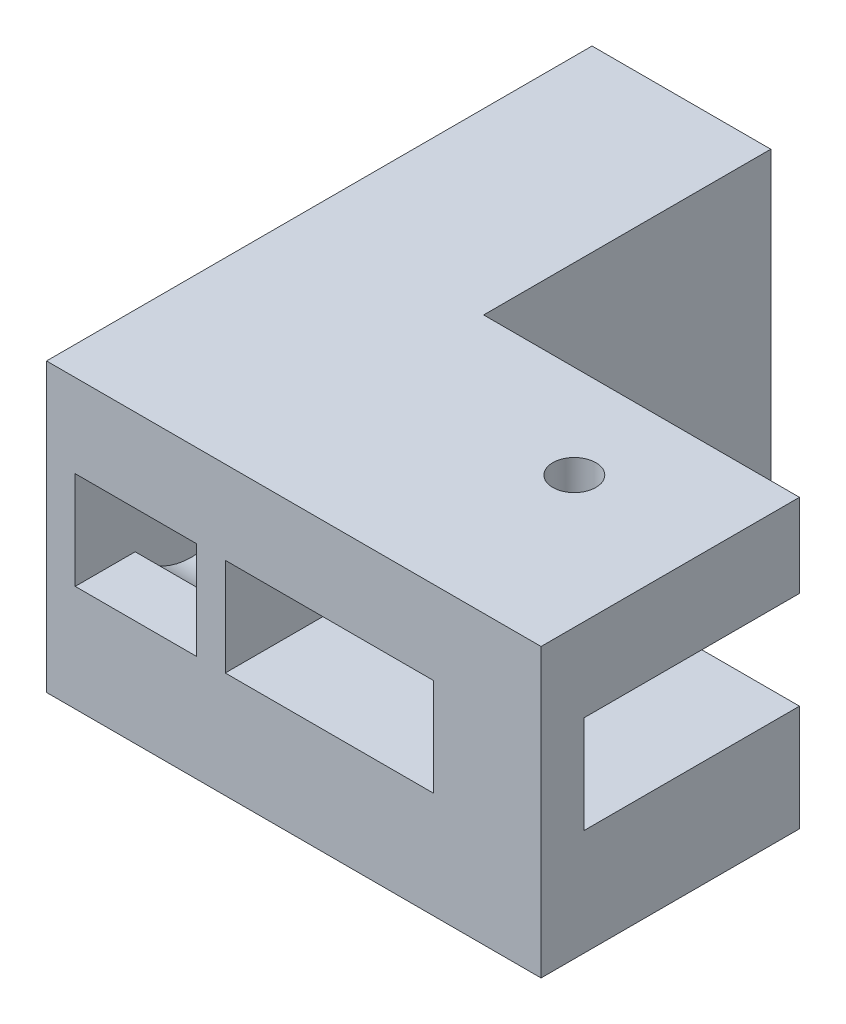
ISO-10303-21;
HEADER;
FILE_DESCRIPTION(('STEP AP214'),'2;1');
FILE_NAME('part.step','',(''),(''),'','','');
FILE_SCHEMA(('AUTOMOTIVE_DESIGN { 1 0 10303 214 1 1 1 1 }'));
ENDSEC;
DATA;
#1=APPLICATION_CONTEXT('core data for automotive mechanical design processes');
#2=APPLICATION_PROTOCOL_DEFINITION('international standard','automotive_design',2000,#1);
#3=PRODUCT_CONTEXT('',#1,'mechanical');
#4=PRODUCT('Part','Part','',(#3));
#5=PRODUCT_RELATED_PRODUCT_CATEGORY('part','',(#4));
#6=PRODUCT_DEFINITION_FORMATION('','',#4);
#7=PRODUCT_DEFINITION_CONTEXT('part definition',#1,'design');
#8=PRODUCT_DEFINITION('design','',#6,#7);
#9=PRODUCT_DEFINITION_SHAPE('','',#8);
#10=(LENGTH_UNIT() NAMED_UNIT(*) SI_UNIT(.MILLI.,.METRE.));
#11=(NAMED_UNIT(*) PLANE_ANGLE_UNIT() SI_UNIT($,.RADIAN.));
#12=(NAMED_UNIT(*) SI_UNIT($,.STERADIAN.) SOLID_ANGLE_UNIT());
#13=UNCERTAINTY_MEASURE_WITH_UNIT(LENGTH_MEASURE(1.E-05),#10,'distance_accuracy_value','');
#14=(GEOMETRIC_REPRESENTATION_CONTEXT(3) GLOBAL_UNCERTAINTY_ASSIGNED_CONTEXT((#13)) GLOBAL_UNIT_ASSIGNED_CONTEXT((#10,
#11,#12)) REPRESENTATION_CONTEXT('',''));
#15=CARTESIAN_POINT('',(0.,0.,0.));
#16=DIRECTION('',(0.,0.,1.));
#17=DIRECTION('',(1.,0.,0.));
#18=AXIS2_PLACEMENT_3D('',#15,#16,#17);
#19=CARTESIAN_POINT('',(0.,3.7,-18.));
#20=DIRECTION('',(0.,1.,0.));
#21=DIRECTION('',(0.,0.,1.));
#22=AXIS2_PLACEMENT_3D('',#19,#20,#21);
#23=PLANE('',#22);
#24=DIRECTION('',(-1.,0.,0.));
#25=VECTOR('',#24,1.);
#26=CARTESIAN_POINT('',(0.,3.7,-13.1965166772067));
#27=LINE('',#26,#25);
#28=CARTESIAN_POINT('',(-4.375,3.69999999991023,-13.1965166770499));
#29=VERTEX_POINT('',#28);
#30=CARTESIAN_POINT('',(-12.825,3.69999999999488,-13.1965166771977));
#31=VERTEX_POINT('',#30);
#32=EDGE_CURVE('E191',#29,#31,#27,.T.);
#33=ORIENTED_EDGE('',*,*,#32,.F.);
#34=DIRECTION('',(0.,0.,1.));
#35=VECTOR('',#34,1.);
#36=CARTESIAN_POINT('',(-4.37500000000001,3.7,-38.));
#37=LINE('',#36,#35);
#38=CARTESIAN_POINT('',(-4.375,3.7,-38.));
#39=VERTEX_POINT('',#38);
#40=EDGE_CURVE('E274',#39,#29,#37,.T.);
#41=ORIENTED_EDGE('',*,*,#40,.F.);
#42=DIRECTION('',(-1.,0.,0.));
#43=VECTOR('',#42,1.);
#44=CARTESIAN_POINT('',(0.,3.7,-38.));
#45=LINE('',#44,#43);
#46=CARTESIAN_POINT('',(-12.825,3.7,-38.));
#47=VERTEX_POINT('',#46);
#48=EDGE_CURVE('E344',#39,#47,#45,.T.);
#49=ORIENTED_EDGE('',*,*,#48,.T.);
#50=DIRECTION('',(0.,0.,-1.));
#51=VECTOR('',#50,1.);
#52=CARTESIAN_POINT('',(-12.825,3.7,-38.));
#53=LINE('',#52,#51);
#54=EDGE_CURVE('E233',#31,#47,#53,.T.);
#55=ORIENTED_EDGE('',*,*,#54,.F.);
#56=EDGE_LOOP('',(#33,#41,#49,#55));
#57=FACE_BOUND('',#56,.T.);
#58=ADVANCED_FACE('F35',(#57),#23,.T.);
#59=CARTESIAN_POINT('',(10.44201924,3.7,-11.5));
#60=DIRECTION('',(0.,1.,0.));
#61=DIRECTION('',(0.,0.,1.));
#62=AXIS2_PLACEMENT_3D('',#59,#60,#61);
#63=CIRCLE('',#62,1.5);
#64=CARTESIAN_POINT('',(10.44201924,3.7,-10.));
#65=VERTEX_POINT('',#64);
#66=EDGE_CURVE('E306',#65,#65,#63,.F.);
#67=ORIENTED_EDGE('',*,*,#66,.T.);
#68=EDGE_LOOP('',(#67));
#69=FACE_BOUND('',#68,.T.);
#70=DIRECTION('',(0.,0.,1.));
#71=VECTOR('',#70,1.);
#72=CARTESIAN_POINT('',(12.125,3.69999999998072,0.));
#73=LINE('',#72,#71);
#74=CARTESIAN_POINT('',(12.125,3.69999999986703,-3.));
#75=VERTEX_POINT('',#74);
#76=CARTESIAN_POINT('',(12.125,3.69999999986703,0.));
#77=VERTEX_POINT('',#76);
#78=EDGE_CURVE('E231',#75,#77,#73,.T.);
#79=ORIENTED_EDGE('',*,*,#78,.F.);
#80=DIRECTION('',(-1.,0.,0.));
#81=VECTOR('',#80,1.);
#82=CARTESIAN_POINT('',(19.625,3.69999999998072,-3.));
#83=LINE('',#82,#81);
#84=CARTESIAN_POINT('',(19.625,3.69999999986703,-3.));
#85=VERTEX_POINT('',#84);
#86=EDGE_CURVE('E229',#85,#75,#83,.T.);
#87=ORIENTED_EDGE('',*,*,#86,.F.);
#88=DIRECTION('',(0.,0.,1.));
#89=VECTOR('',#88,1.);
#90=CARTESIAN_POINT('',(19.625,3.7,0.));
#91=LINE('',#90,#89);
#92=CARTESIAN_POINT('',(19.625,3.7,-18.));
#93=VERTEX_POINT('',#92);
#94=EDGE_CURVE('E318',#93,#85,#91,.T.);
#95=ORIENTED_EDGE('',*,*,#94,.F.);
#96=DIRECTION('',(-1.,0.,0.));
#97=VECTOR('',#96,1.);
#98=CARTESIAN_POINT('',(0.,3.7,-18.));
#99=LINE('',#98,#97);
#100=CARTESIAN_POINT('',(-2.375,3.7,-18.));
#101=VERTEX_POINT('',#100);
#102=EDGE_CURVE('E415',#93,#101,#99,.T.);
#103=ORIENTED_EDGE('',*,*,#102,.T.);
#104=DIRECTION('',(0.,0.,-1.));
#105=VECTOR('',#104,1.);
#106=CARTESIAN_POINT('',(-2.37500000000001,3.7,-38.));
#107=LINE('',#106,#105);
#108=CARTESIAN_POINT('',(-2.375,3.7,0.));
#109=VERTEX_POINT('',#108);
#110=EDGE_CURVE('E299',#109,#101,#107,.T.);
#111=ORIENTED_EDGE('',*,*,#110,.F.);
#112=DIRECTION('',(-1.,0.,0.));
#113=VECTOR('',#112,1.);
#114=CARTESIAN_POINT('',(0.,3.7,0.));
#115=LINE('',#114,#113);
#116=EDGE_CURVE('E392',#77,#109,#115,.T.);
#117=ORIENTED_EDGE('',*,*,#116,.F.);
#118=EDGE_LOOP('',(#79,#87,#95,#103,#111,#117));
#119=FACE_BOUND('',#118,.T.);
#120=ADVANCED_FACE('F377',(#69,#119),#23,.T.);
#121=CARTESIAN_POINT('',(0.,10.5,-18.));
#122=DIRECTION('',(0.,1.,0.));
#123=DIRECTION('',(0.,0.,1.));
#124=AXIS2_PLACEMENT_3D('',#121,#122,#123);
#125=PLANE('',#124);
#126=CARTESIAN_POINT('',(10.44201924,10.5,-11.5));
#127=DIRECTION('',(0.,1.,0.));
#128=DIRECTION('',(0.,0.,1.));
#129=AXIS2_PLACEMENT_3D('',#126,#127,#128);
#130=CIRCLE('',#129,1.5);
#131=CARTESIAN_POINT('',(10.44201924,10.5,-10.));
#132=VERTEX_POINT('',#131);
#133=EDGE_CURVE('E246',#132,#132,#130,.F.);
#134=ORIENTED_EDGE('',*,*,#133,.F.);
#135=EDGE_LOOP('',(#134));
#136=FACE_BOUND('',#135,.T.);
#137=DIRECTION('',(1.,0.,0.));
#138=VECTOR('',#137,1.);
#139=CARTESIAN_POINT('',(19.625,10.5,-3.));
#140=LINE('',#139,#138);
#141=CARTESIAN_POINT('',(12.125,10.5,-3.));
#142=VERTEX_POINT('',#141);
#143=CARTESIAN_POINT('',(19.625,10.5,-3.));
#144=VERTEX_POINT('',#143);
#145=EDGE_CURVE('E61',#142,#144,#140,.T.);
#146=ORIENTED_EDGE('',*,*,#145,.F.);
#147=DIRECTION('',(0.,0.,-1.));
#148=VECTOR('',#147,1.);
#149=CARTESIAN_POINT('',(12.125,10.5,0.));
#150=LINE('',#149,#148);
#151=CARTESIAN_POINT('',(12.125,10.5,0.));
#152=VERTEX_POINT('',#151);
#153=EDGE_CURVE('E219',#152,#142,#150,.T.);
#154=ORIENTED_EDGE('',*,*,#153,.F.);
#155=DIRECTION('',(-1.,0.,0.));
#156=VECTOR('',#155,1.);
#157=CARTESIAN_POINT('',(0.,10.5,0.));
#158=LINE('',#157,#156);
#159=CARTESIAN_POINT('',(-2.375,10.5000000000928,0.));
#160=VERTEX_POINT('',#159);
#161=EDGE_CURVE('E476',#152,#160,#158,.T.);
#162=ORIENTED_EDGE('',*,*,#161,.T.);
#163=DIRECTION('',(0.,0.,-1.));
#164=VECTOR('',#163,1.);
#165=CARTESIAN_POINT('',(-2.37500000000001,10.4999999999791,-38.));
#166=LINE('',#165,#164);
#167=CARTESIAN_POINT('',(-2.375,10.4999999999791,-18.));
#168=VERTEX_POINT('',#167);
#169=EDGE_CURVE('E284',#160,#168,#166,.T.);
#170=ORIENTED_EDGE('',*,*,#169,.T.);
#171=DIRECTION('',(-1.,0.,0.));
#172=VECTOR('',#171,1.);
#173=CARTESIAN_POINT('',(0.,10.5,-18.));
#174=LINE('',#173,#172);
#175=CARTESIAN_POINT('',(19.625,10.5,-18.));
#176=VERTEX_POINT('',#175);
#177=EDGE_CURVE('E468',#176,#168,#174,.T.);
#178=ORIENTED_EDGE('',*,*,#177,.F.);
#179=DIRECTION('',(0.,0.,-1.));
#180=VECTOR('',#179,1.);
#181=CARTESIAN_POINT('',(19.625,10.5,0.));
#182=LINE('',#181,#180);
#183=EDGE_CURVE('E249',#144,#176,#182,.T.);
#184=ORIENTED_EDGE('',*,*,#183,.F.);
#185=EDGE_LOOP('',(#146,#154,#162,#170,#178,#184));
#186=FACE_BOUND('',#185,.T.);
#187=ADVANCED_FACE('F381',(#136,#186),#125,.F.);
#188=DIRECTION('',(-1.,0.,0.));
#189=VECTOR('',#188,1.);
#190=CARTESIAN_POINT('',(11.8159067757885,3.7,-4.17490181107975));
#191=LINE('',#190,#189);
#192=CARTESIAN_POINT('',(-12.825,3.7,-4.17490181107975));
#193=VERTEX_POINT('',#192);
#194=CARTESIAN_POINT('',(-4.375,3.7,-4.17490181107975));
#195=VERTEX_POINT('',#194);
#196=EDGE_CURVE('E209',#193,#195,#191,.F.);
#197=ORIENTED_EDGE('',*,*,#196,.F.);
#198=CARTESIAN_POINT('',(-12.825,3.7,0.));
#199=VERTEX_POINT('',#198);
#200=EDGE_CURVE('E205',#199,#193,#53,.T.);
#201=ORIENTED_EDGE('',*,*,#200,.F.);
#202=CARTESIAN_POINT('',(-4.375,3.7,0.));
#203=VERTEX_POINT('',#202);
#204=EDGE_CURVE('E352',#203,#199,#115,.T.);
#205=ORIENTED_EDGE('',*,*,#204,.F.);
#206=EDGE_CURVE('E39',#195,#203,#37,.T.);
#207=ORIENTED_EDGE('',*,*,#206,.F.);
#208=EDGE_LOOP('',(#197,#201,#205,#207));
#209=FACE_BOUND('',#208,.T.);
#210=ADVANCED_FACE('F37',(#209),#23,.T.);
#211=DIRECTION('',(0.,0.,-1.));
#212=VECTOR('',#211,1.);
#213=CARTESIAN_POINT('',(-12.825,10.4999999999791,-38.));
#214=LINE('',#213,#212);
#215=CARTESIAN_POINT('',(-12.825,10.5000000000928,0.));
#216=VERTEX_POINT('',#215);
#217=CARTESIAN_POINT('',(-12.825,10.5000000000928,-38.));
#218=VERTEX_POINT('',#217);
#219=EDGE_CURVE('E238',#216,#218,#214,.T.);
#220=ORIENTED_EDGE('',*,*,#219,.T.);
#221=DIRECTION('',(-1.,0.,0.));
#222=VECTOR('',#221,1.);
#223=CARTESIAN_POINT('',(0.,10.5,-38.));
#224=LINE('',#223,#222);
#225=CARTESIAN_POINT('',(-4.37500000000001,10.5000000000928,-38.));
#226=VERTEX_POINT('',#225);
#227=EDGE_CURVE('E257',#226,#218,#224,.T.);
#228=ORIENTED_EDGE('',*,*,#227,.F.);
#229=DIRECTION('',(0.,0.,1.));
#230=VECTOR('',#229,1.);
#231=CARTESIAN_POINT('',(-4.37500000000001,10.4999999999791,-38.));
#232=LINE('',#231,#230);
#233=CARTESIAN_POINT('',(-4.375,10.5,0.));
#234=VERTEX_POINT('',#233);
#235=EDGE_CURVE('E294',#226,#234,#232,.T.);
#236=ORIENTED_EDGE('',*,*,#235,.T.);
#237=EDGE_CURVE('E265',#234,#216,#158,.T.);
#238=ORIENTED_EDGE('',*,*,#237,.T.);
#239=EDGE_LOOP('',(#220,#228,#236,#238));
#240=FACE_BOUND('',#239,.T.);
#241=ADVANCED_FACE('F371',(#240),#125,.F.);
#242=CARTESIAN_POINT('',(0.,-0.700000000000003,-38.));
#243=DIRECTION('',(0.,-1.,0.));
#244=DIRECTION('',(0.,0.,-1.));
#245=AXIS2_PLACEMENT_3D('',#242,#243,#244);
#246=PLANE('',#245);
#247=DIRECTION('',(0.,0.,1.));
#248=VECTOR('',#247,1.);
#249=CARTESIAN_POINT('',(-9.825,-0.700000000000003,-38.));
#250=LINE('',#249,#248);
#251=CARTESIAN_POINT('',(-9.825,-0.700000000000003,-38.));
#252=VERTEX_POINT('',#251);
#253=CARTESIAN_POINT('',(-9.825,-0.700000000000003,-10.));
#254=VERTEX_POINT('',#253);
#255=EDGE_CURVE('E409',#252,#254,#250,.T.);
#256=ORIENTED_EDGE('',*,*,#255,.T.);
#257=DIRECTION('',(1.,0.,0.));
#258=VECTOR('',#257,1.);
#259=CARTESIAN_POINT('',(0.,-0.700000000000003,-10.));
#260=LINE('',#259,#258);
#261=CARTESIAN_POINT('',(-14.825,-0.700000000000003,-10.));
#262=VERTEX_POINT('',#261);
#263=EDGE_CURVE('E324',#262,#254,#260,.T.);
#264=ORIENTED_EDGE('',*,*,#263,.F.);
#265=DIRECTION('',(0.,0.,1.));
#266=VECTOR('',#265,1.);
#267=CARTESIAN_POINT('',(-14.825,-0.700000000000003,-38.));
#268=LINE('',#267,#266);
#269=CARTESIAN_POINT('',(-14.825,-0.700000000000003,-38.));
#270=VERTEX_POINT('',#269);
#271=EDGE_CURVE('E393',#270,#262,#268,.T.);
#272=ORIENTED_EDGE('',*,*,#271,.F.);
#273=DIRECTION('',(1.,0.,0.));
#274=VECTOR('',#273,1.);
#275=CARTESIAN_POINT('',(0.,-0.700000000000003,-38.));
#276=LINE('',#275,#274);
#277=EDGE_CURVE('E334',#270,#252,#276,.T.);
#278=ORIENTED_EDGE('',*,*,#277,.T.);
#279=EDGE_LOOP('',(#256,#264,#272,#278));
#280=FACE_BOUND('',#279,.T.);
#281=ADVANCED_FACE('F389',(#280),#246,.T.);
#282=CARTESIAN_POINT('',(-9.825,0.,-38.));
#283=DIRECTION('',(-1.,0.,0.));
#284=DIRECTION('',(0.,0.,1.));
#285=AXIS2_PLACEMENT_3D('',#282,#283,#284);
#286=PLANE('',#285);
#287=DIRECTION('',(0.,0.,1.));
#288=VECTOR('',#287,1.);
#289=CARTESIAN_POINT('',(-9.825,-3.7,-38.));
#290=LINE('',#289,#288);
#291=CARTESIAN_POINT('',(-9.825,-3.7,-38.));
#292=VERTEX_POINT('',#291);
#293=CARTESIAN_POINT('',(-9.825,-3.7,-10.));
#294=VERTEX_POINT('',#293);
#295=EDGE_CURVE('E402',#292,#294,#290,.T.);
#296=ORIENTED_EDGE('',*,*,#295,.T.);
#297=DIRECTION('',(0.,-1.,0.));
#298=VECTOR('',#297,1.);
#299=CARTESIAN_POINT('',(-9.825,0.,-10.));
#300=LINE('',#299,#298);
#301=EDGE_CURVE('E321',#254,#294,#300,.T.);
#302=ORIENTED_EDGE('',*,*,#301,.F.);
#303=ORIENTED_EDGE('',*,*,#255,.F.);
#304=DIRECTION('',(0.,-1.,0.));
#305=VECTOR('',#304,1.);
#306=CARTESIAN_POINT('',(-9.825,0.,-38.));
#307=LINE('',#306,#305);
#308=EDGE_CURVE('E337',#252,#292,#307,.T.);
#309=ORIENTED_EDGE('',*,*,#308,.T.);
#310=EDGE_LOOP('',(#296,#302,#303,#309));
#311=FACE_BOUND('',#310,.T.);
#312=ADVANCED_FACE('F491',(#311),#286,.T.);
#313=CARTESIAN_POINT('',(0.,-3.7,-18.));
#314=DIRECTION('',(0.,1.,0.));
#315=DIRECTION('',(-1.,0.,0.));
#316=AXIS2_PLACEMENT_3D('',#313,#314,#315);
#317=PLANE('',#316);
#318=CARTESIAN_POINT('',(10.44201924,-3.7,-11.5));
#319=DIRECTION('',(0.,1.,0.));
#320=DIRECTION('',(-1.,0.,0.));
#321=AXIS2_PLACEMENT_3D('',#318,#319,#320);
#322=CIRCLE('',#321,1.5);
#323=CARTESIAN_POINT('',(8.94201924000001,-3.7,-11.5));
#324=VERTEX_POINT('',#323);
#325=EDGE_CURVE('E303',#324,#324,#322,.F.);
#326=ORIENTED_EDGE('',*,*,#325,.F.);
#327=EDGE_LOOP('',(#326));
#328=FACE_BOUND('',#327,.T.);
#329=DIRECTION('',(-1.,0.,0.));
#330=VECTOR('',#329,1.);
#331=CARTESIAN_POINT('',(0.,-3.7,0.));
#332=LINE('',#331,#330);
#333=CARTESIAN_POINT('',(19.625,-3.7,0.));
#334=VERTEX_POINT('',#333);
#335=CARTESIAN_POINT('',(-14.825,-3.7,0.));
#336=VERTEX_POINT('',#335);
#337=EDGE_CURVE('E394',#334,#336,#332,.T.);
#338=ORIENTED_EDGE('',*,*,#337,.T.);
#339=DIRECTION('',(0.,0.,1.));
#340=VECTOR('',#339,1.);
#341=CARTESIAN_POINT('',(-14.825,-3.7,-10.));
#342=LINE('',#341,#340);
#343=CARTESIAN_POINT('',(-14.825,-3.7,-10.));
#344=VERTEX_POINT('',#343);
#345=EDGE_CURVE('E330',#344,#336,#342,.T.);
#346=ORIENTED_EDGE('',*,*,#345,.F.);
#347=DIRECTION('',(-1.,0.,0.));
#348=VECTOR('',#347,1.);
#349=CARTESIAN_POINT('',(0.,-3.7,-10.));
#350=LINE('',#349,#348);
#351=EDGE_CURVE('E328',#294,#344,#350,.T.);
#352=ORIENTED_EDGE('',*,*,#351,.F.);
#353=ORIENTED_EDGE('',*,*,#295,.F.);
#354=DIRECTION('',(-1.,0.,0.));
#355=VECTOR('',#354,1.);
#356=CARTESIAN_POINT('',(0.,-3.7,-38.));
#357=LINE('',#356,#355);
#358=CARTESIAN_POINT('',(-2.375,-3.7,-38.));
#359=VERTEX_POINT('',#358);
#360=EDGE_CURVE('E340',#359,#292,#357,.T.);
#361=ORIENTED_EDGE('',*,*,#360,.F.);
#362=DIRECTION('',(0.,0.,1.));
#363=VECTOR('',#362,1.);
#364=CARTESIAN_POINT('',(-2.375,-3.7,-38.));
#365=LINE('',#364,#363);
#366=CARTESIAN_POINT('',(-2.375,-3.7,-18.));
#367=VERTEX_POINT('',#366);
#368=EDGE_CURVE('E396',#359,#367,#365,.T.);
#369=ORIENTED_EDGE('',*,*,#368,.T.);
#370=DIRECTION('',(-1.,0.,0.));
#371=VECTOR('',#370,1.);
#372=CARTESIAN_POINT('',(0.,-3.7,-18.));
#373=LINE('',#372,#371);
#374=CARTESIAN_POINT('',(19.625,-3.7,-18.));
#375=VERTEX_POINT('',#374);
#376=EDGE_CURVE('E11',#375,#367,#373,.T.);
#377=ORIENTED_EDGE('',*,*,#376,.F.);
#378=DIRECTION('',(0.,0.,-1.));
#379=VECTOR('',#378,1.);
#380=CARTESIAN_POINT('',(19.625,-3.7,0.));
#381=LINE('',#380,#379);
#382=EDGE_CURVE('E312',#334,#375,#381,.T.);
#383=ORIENTED_EDGE('',*,*,#382,.F.);
#384=EDGE_LOOP('',(#338,#346,#352,#353,#361,#369,#377,#383));
#385=FACE_BOUND('',#384,.T.);
#386=ADVANCED_FACE('F428',(#328,#385),#317,.F.);
#387=CARTESIAN_POINT('',(0.,0.,-18.));
#388=DIRECTION('',(0.,0.,1.));
#389=DIRECTION('',(1.,0.,0.));
#390=AXIS2_PLACEMENT_3D('',#387,#388,#389);
#391=PLANE('',#390);
#392=ORIENTED_EDGE('',*,*,#102,.F.);
#393=DIRECTION('',(0.,1.,0.));
#394=VECTOR('',#393,1.);
#395=CARTESIAN_POINT('',(19.625,3.7,-18.));
#396=LINE('',#395,#394);
#397=EDGE_CURVE('E315',#375,#93,#396,.T.);
#398=ORIENTED_EDGE('',*,*,#397,.F.);
#399=ORIENTED_EDGE('',*,*,#376,.T.);
#400=DIRECTION('',(0.,-1.,0.));
#401=VECTOR('',#400,1.);
#402=CARTESIAN_POINT('',(-2.375,0.,-18.));
#403=LINE('',#402,#401);
#404=EDGE_CURVE('E45',#101,#367,#403,.T.);
#405=ORIENTED_EDGE('',*,*,#404,.F.);
#406=EDGE_LOOP('',(#392,#398,#399,#405));
#407=FACE_BOUND('',#406,.T.);
#408=ADVANCED_FACE('F498',(#407),#391,.F.);
#409=CARTESIAN_POINT('',(0.,0.,0.));
#410=DIRECTION('',(0.,0.,1.));
#411=DIRECTION('',(1.,0.,0.));
#412=AXIS2_PLACEMENT_3D('',#409,#410,#411);
#413=PLANE('',#412);
#414=DIRECTION('',(0.,1.,0.));
#415=VECTOR('',#414,1.);
#416=CARTESIAN_POINT('',(12.125,-500000.,0.));
#417=LINE('',#416,#415);
#418=EDGE_CURVE('E227',#77,#152,#417,.T.);
#419=ORIENTED_EDGE('',*,*,#418,.F.);
#420=ORIENTED_EDGE('',*,*,#116,.T.);
#421=DIRECTION('',(0.,-1.,0.));
#422=VECTOR('',#421,1.);
#423=CARTESIAN_POINT('',(-2.37500000005515,500000.,0.));
#424=LINE('',#423,#422);
#425=EDGE_CURVE('E278',#160,#109,#424,.T.);
#426=ORIENTED_EDGE('',*,*,#425,.F.);
#427=ORIENTED_EDGE('',*,*,#161,.F.);
#428=EDGE_LOOP('',(#419,#420,#426,#427));
#429=FACE_BOUND('',#428,.T.);
#430=ORIENTED_EDGE('',*,*,#204,.T.);
#431=DIRECTION('',(0.,-1.,0.));
#432=VECTOR('',#431,1.);
#433=CARTESIAN_POINT('',(-12.8250000000552,500000.,0.));
#434=LINE('',#433,#432);
#435=EDGE_CURVE('E236',#216,#199,#434,.T.);
#436=ORIENTED_EDGE('',*,*,#435,.F.);
#437=ORIENTED_EDGE('',*,*,#237,.F.);
#438=DIRECTION('',(0.,-1.,0.));
#439=VECTOR('',#438,1.);
#440=CARTESIAN_POINT('',(-4.37500000005515,500000.,0.));
#441=LINE('',#440,#439);
#442=EDGE_CURVE('E285',#234,#203,#441,.T.);
#443=ORIENTED_EDGE('',*,*,#442,.T.);
#444=EDGE_LOOP('',(#430,#436,#437,#443));
#445=FACE_BOUND('',#444,.T.);
#446=DIRECTION('',(0.,-1.,0.));
#447=VECTOR('',#446,1.);
#448=CARTESIAN_POINT('',(19.625,3.7,0.));
#449=LINE('',#448,#447);
#450=CARTESIAN_POINT('',(19.625,16.3,0.));
#451=VERTEX_POINT('',#450);
#452=EDGE_CURVE('E309',#451,#334,#449,.T.);
#453=ORIENTED_EDGE('',*,*,#452,.F.);
#454=DIRECTION('',(-1.,0.,0.));
#455=VECTOR('',#454,1.);
#456=CARTESIAN_POINT('',(0.,16.3,0.));
#457=LINE('',#456,#455);
#458=CARTESIAN_POINT('',(-14.825,16.3,0.));
#459=VERTEX_POINT('',#458);
#460=EDGE_CURVE('E466',#451,#459,#457,.T.);
#461=ORIENTED_EDGE('',*,*,#460,.T.);
#462=DIRECTION('',(0.,1.,0.));
#463=VECTOR('',#462,1.);
#464=CARTESIAN_POINT('',(-14.825,0.,0.));
#465=LINE('',#464,#463);
#466=EDGE_CURVE('E333',#336,#459,#465,.T.);
#467=ORIENTED_EDGE('',*,*,#466,.F.);
#468=ORIENTED_EDGE('',*,*,#337,.F.);
#469=EDGE_LOOP('',(#453,#461,#467,#468));
#470=FACE_BOUND('',#469,.T.);
#471=ADVANCED_FACE('F359',(#429,#445,#470),#413,.T.);
#472=CARTESIAN_POINT('',(-2.375,0.,-38.));
#473=DIRECTION('',(-1.,0.,0.));
#474=DIRECTION('',(0.,-1.,0.));
#475=AXIS2_PLACEMENT_3D('',#472,#473,#474);
#476=PLANE('',#475);
#477=DIRECTION('',(0.,-1.,0.));
#478=VECTOR('',#477,1.);
#479=CARTESIAN_POINT('',(-2.375,0.,-38.));
#480=LINE('',#479,#478);
#481=CARTESIAN_POINT('',(-2.375,16.3,-38.));
#482=VERTEX_POINT('',#481);
#483=EDGE_CURVE('E342',#482,#359,#480,.T.);
#484=ORIENTED_EDGE('',*,*,#483,.F.);
#485=DIRECTION('',(0.,0.,1.));
#486=VECTOR('',#485,1.);
#487=CARTESIAN_POINT('',(-2.375,16.3,-38.));
#488=LINE('',#487,#486);
#489=CARTESIAN_POINT('',(-2.375,16.3,-18.));
#490=VERTEX_POINT('',#489);
#491=EDGE_CURVE('E449',#482,#490,#488,.T.);
#492=ORIENTED_EDGE('',*,*,#491,.T.);
#493=DIRECTION('',(0.,1.,0.));
#494=VECTOR('',#493,1.);
#495=CARTESIAN_POINT('',(-2.375,0.,-18.));
#496=LINE('',#495,#494);
#497=EDGE_CURVE('E302',#168,#490,#496,.T.);
#498=ORIENTED_EDGE('',*,*,#497,.F.);
#499=ORIENTED_EDGE('',*,*,#169,.F.);
#500=ORIENTED_EDGE('',*,*,#425,.T.);
#501=ORIENTED_EDGE('',*,*,#110,.T.);
#502=ORIENTED_EDGE('',*,*,#404,.T.);
#503=ORIENTED_EDGE('',*,*,#368,.F.);
#504=EDGE_LOOP('',(#484,#492,#498,#499,#500,#501,#502,#503));
#505=FACE_BOUND('',#504,.T.);
#506=ADVANCED_FACE('F484',(#505),#476,.F.);
#507=CARTESIAN_POINT('',(-14.825,0.,-38.));
#508=DIRECTION('',(1.,0.,0.));
#509=DIRECTION('',(0.,0.,-1.));
#510=AXIS2_PLACEMENT_3D('',#507,#508,#509);
#511=PLANE('',#510);
#512=CARTESIAN_POINT('',(-14.825,5.90953503060943,-8.09510014133165));
#513=DIRECTION('',(-1.,0.,0.));
#514=DIRECTION('',(0.,-1.,0.));
#515=AXIS2_PLACEMENT_3D('',#512,#513,#514);
#516=CIRCLE('',#515,2.);
#517=CARTESIAN_POINT('',(-14.825,3.90953503060943,-8.09510014133165));
#518=VERTEX_POINT('',#517);
#519=EDGE_CURVE('E213',#518,#518,#516,.T.);
#520=ORIENTED_EDGE('',*,*,#519,.F.);
#521=EDGE_LOOP('',(#520));
#522=FACE_BOUND('',#521,.T.);
#523=ORIENTED_EDGE('',*,*,#466,.T.);
#524=DIRECTION('',(0.,0.,1.));
#525=VECTOR('',#524,1.);
#526=CARTESIAN_POINT('',(-14.825,16.3,-38.));
#527=LINE('',#526,#525);
#528=CARTESIAN_POINT('',(-14.825,16.3,-38.));
#529=VERTEX_POINT('',#528);
#530=EDGE_CURVE('E446',#529,#459,#527,.T.);
#531=ORIENTED_EDGE('',*,*,#530,.F.);
#532=DIRECTION('',(0.,1.,0.));
#533=VECTOR('',#532,1.);
#534=CARTESIAN_POINT('',(-14.825,0.,-38.));
#535=LINE('',#534,#533);
#536=EDGE_CURVE('E347',#270,#529,#535,.T.);
#537=ORIENTED_EDGE('',*,*,#536,.F.);
#538=ORIENTED_EDGE('',*,*,#271,.T.);
#539=DIRECTION('',(0.,1.,0.));
#540=VECTOR('',#539,1.);
#541=CARTESIAN_POINT('',(-14.825,0.,-10.));
#542=LINE('',#541,#540);
#543=EDGE_CURVE('E326',#344,#262,#542,.T.);
#544=ORIENTED_EDGE('',*,*,#543,.F.);
#545=ORIENTED_EDGE('',*,*,#345,.T.);
#546=EDGE_LOOP('',(#523,#531,#537,#538,#544,#545));
#547=FACE_BOUND('',#546,.T.);
#548=ADVANCED_FACE('F429',(#522,#547),#511,.F.);
#549=CARTESIAN_POINT('',(0.,0.,-38.));
#550=DIRECTION('',(0.,0.,1.));
#551=DIRECTION('',(1.,0.,0.));
#552=AXIS2_PLACEMENT_3D('',#549,#550,#551);
#553=PLANE('',#552);
#554=ORIENTED_EDGE('',*,*,#536,.T.);
#555=DIRECTION('',(-1.,0.,0.));
#556=VECTOR('',#555,1.);
#557=CARTESIAN_POINT('',(0.,16.3,-38.));
#558=LINE('',#557,#556);
#559=EDGE_CURVE('E260',#482,#529,#558,.T.);
#560=ORIENTED_EDGE('',*,*,#559,.F.);
#561=ORIENTED_EDGE('',*,*,#483,.T.);
#562=ORIENTED_EDGE('',*,*,#360,.T.);
#563=ORIENTED_EDGE('',*,*,#308,.F.);
#564=ORIENTED_EDGE('',*,*,#277,.F.);
#565=EDGE_LOOP('',(#554,#560,#561,#562,#563,#564));
#566=FACE_BOUND('',#565,.T.);
#567=DIRECTION('',(0.,-1.,0.));
#568=VECTOR('',#567,1.);
#569=CARTESIAN_POINT('',(-12.8250000000552,500000.,-38.));
#570=LINE('',#569,#568);
#571=EDGE_CURVE('E235',#218,#47,#570,.T.);
#572=ORIENTED_EDGE('',*,*,#571,.T.);
#573=ORIENTED_EDGE('',*,*,#48,.F.);
#574=DIRECTION('',(0.,-1.,0.));
#575=VECTOR('',#574,1.);
#576=CARTESIAN_POINT('',(-4.37500000005517,500000.,-38.));
#577=LINE('',#576,#575);
#578=EDGE_CURVE('E281',#226,#39,#577,.T.);
#579=ORIENTED_EDGE('',*,*,#578,.F.);
#580=ORIENTED_EDGE('',*,*,#227,.T.);
#581=EDGE_LOOP('',(#572,#573,#579,#580));
#582=FACE_BOUND('',#581,.T.);
#583=ADVANCED_FACE('F373',(#566,#582),#553,.F.);
#584=CARTESIAN_POINT('',(0.,0.,-10.));
#585=DIRECTION('',(0.,0.,1.));
#586=DIRECTION('',(1.,0.,0.));
#587=AXIS2_PLACEMENT_3D('',#584,#585,#586);
#588=PLANE('',#587);
#589=ORIENTED_EDGE('',*,*,#301,.T.);
#590=ORIENTED_EDGE('',*,*,#351,.T.);
#591=ORIENTED_EDGE('',*,*,#543,.T.);
#592=ORIENTED_EDGE('',*,*,#263,.T.);
#593=EDGE_LOOP('',(#589,#590,#591,#592));
#594=FACE_BOUND('',#593,.T.);
#595=ADVANCED_FACE('F434',(#594),#588,.F.);
#596=CARTESIAN_POINT('',(19.625,0.,0.));
#597=DIRECTION('',(1.,0.,0.));
#598=DIRECTION('',(0.,0.,-1.));
#599=AXIS2_PLACEMENT_3D('',#596,#597,#598);
#600=PLANE('',#599);
#601=ORIENTED_EDGE('',*,*,#452,.T.);
#602=ORIENTED_EDGE('',*,*,#382,.T.);
#603=ORIENTED_EDGE('',*,*,#397,.T.);
#604=ORIENTED_EDGE('',*,*,#94,.T.);
#605=DIRECTION('',(0.,1.,0.));
#606=VECTOR('',#605,1.);
#607=CARTESIAN_POINT('',(19.625,-500000.,-3.));
#608=LINE('',#607,#606);
#609=EDGE_CURVE('E222',#85,#144,#608,.T.);
#610=ORIENTED_EDGE('',*,*,#609,.T.);
#611=ORIENTED_EDGE('',*,*,#183,.T.);
#612=DIRECTION('',(0.,1.,0.));
#613=VECTOR('',#612,1.);
#614=CARTESIAN_POINT('',(19.625,16.3,-18.));
#615=LINE('',#614,#613);
#616=CARTESIAN_POINT('',(19.625,16.3,-18.));
#617=VERTEX_POINT('',#616);
#618=EDGE_CURVE('E251',#176,#617,#615,.T.);
#619=ORIENTED_EDGE('',*,*,#618,.T.);
#620=DIRECTION('',(0.,0.,1.));
#621=VECTOR('',#620,1.);
#622=CARTESIAN_POINT('',(19.625,16.3,0.));
#623=LINE('',#622,#621);
#624=EDGE_CURVE('E254',#617,#451,#623,.T.);
#625=ORIENTED_EDGE('',*,*,#624,.T.);
#626=EDGE_LOOP('',(#601,#602,#603,#604,#610,#611,#619,#625));
#627=FACE_BOUND('',#626,.T.);
#628=ADVANCED_FACE('F522',(#627),#600,.T.);
#629=CARTESIAN_POINT('',(10.44201924,20.5426406871193,-11.5));
#630=DIRECTION('',(0.,-1.,0.));
#631=DIRECTION('',(1.,0.,0.));
#632=AXIS2_PLACEMENT_3D('',#629,#630,#631);
#633=CYLINDRICAL_SURFACE('',#632,1.5);
#634=ORIENTED_EDGE('',*,*,#66,.F.);
#635=EDGE_LOOP('',(#634));
#636=FACE_BOUND('',#635,.T.);
#637=ORIENTED_EDGE('',*,*,#325,.T.);
#638=EDGE_LOOP('',(#637));
#639=FACE_BOUND('',#638,.T.);
#640=ADVANCED_FACE('F525',(#636,#639),#633,.F.);
#641=CARTESIAN_POINT('',(-4.37500000005517,500000.,-38.));
#642=DIRECTION('',(1.,0.,0.));
#643=DIRECTION('',(0.,0.,-1.));
#644=AXIS2_PLACEMENT_3D('',#641,#642,#643);
#645=PLANE('',#644);
#646=ORIENTED_EDGE('',*,*,#40,.T.);
#647=DIRECTION('',(0.,-0.497017920763421,0.867740275912099));
#648=VECTOR('',#647,1.);
#649=CARTESIAN_POINT('',(-4.375,-2.90542548771579,-1.66414833438459));
#650=LINE('',#649,#648);
#651=CARTESIAN_POINT('',(-4.375,1.72256676183607,-9.74412916360049));
#652=VERTEX_POINT('',#651);
#653=EDGE_CURVE('E194',#29,#652,#650,.T.);
#654=ORIENTED_EDGE('',*,*,#653,.T.);
#655=CARTESIAN_POINT('',(-4.375,5.90953503060943,-8.09510014133165));
#656=DIRECTION('',(1.,0.,0.));
#657=DIRECTION('',(0.,0.,-1.));
#658=AXIS2_PLACEMENT_3D('',#655,#656,#657);
#659=CIRCLE('',#658,4.5);
#660=EDGE_CURVE('E199',#652,#195,#659,.F.);
#661=ORIENTED_EDGE('',*,*,#660,.T.);
#662=ORIENTED_EDGE('',*,*,#206,.T.);
#663=ORIENTED_EDGE('',*,*,#442,.F.);
#664=ORIENTED_EDGE('',*,*,#235,.F.);
#665=ORIENTED_EDGE('',*,*,#578,.T.);
#666=EDGE_LOOP('',(#646,#654,#661,#662,#663,#664,#665));
#667=FACE_BOUND('',#666,.T.);
#668=ADVANCED_FACE('F366',(#667),#645,.F.);
#669=CARTESIAN_POINT('',(0.,16.3,-18.));
#670=DIRECTION('',(0.,1.,0.));
#671=DIRECTION('',(-1.,0.,0.));
#672=AXIS2_PLACEMENT_3D('',#669,#670,#671);
#673=PLANE('',#672);
#674=CARTESIAN_POINT('',(10.44201924,16.3,-11.5));
#675=DIRECTION('',(0.,1.,0.));
#676=DIRECTION('',(-1.,0.,0.));
#677=AXIS2_PLACEMENT_3D('',#674,#675,#676);
#678=CIRCLE('',#677,1.5);
#679=CARTESIAN_POINT('',(8.94201924,16.3,-11.5));
#680=VERTEX_POINT('',#679);
#681=EDGE_CURVE('E243',#680,#680,#678,.T.);
#682=ORIENTED_EDGE('',*,*,#681,.F.);
#683=EDGE_LOOP('',(#682));
#684=FACE_BOUND('',#683,.T.);
#685=ORIENTED_EDGE('',*,*,#460,.F.);
#686=ORIENTED_EDGE('',*,*,#624,.F.);
#687=DIRECTION('',(-1.,0.,0.));
#688=VECTOR('',#687,1.);
#689=CARTESIAN_POINT('',(0.,16.3,-18.));
#690=LINE('',#689,#688);
#691=EDGE_CURVE('E465',#617,#490,#690,.T.);
#692=ORIENTED_EDGE('',*,*,#691,.T.);
#693=ORIENTED_EDGE('',*,*,#491,.F.);
#694=ORIENTED_EDGE('',*,*,#559,.T.);
#695=ORIENTED_EDGE('',*,*,#530,.T.);
#696=EDGE_LOOP('',(#685,#686,#692,#693,#694,#695));
#697=FACE_BOUND('',#696,.T.);
#698=ADVANCED_FACE('F451',(#684,#697),#673,.T.);
#699=CARTESIAN_POINT('',(0.,0.,-18.));
#700=DIRECTION('',(0.,0.,1.));
#701=DIRECTION('',(1.,0.,0.));
#702=AXIS2_PLACEMENT_3D('',#699,#700,#701);
#703=PLANE('',#702);
#704=ORIENTED_EDGE('',*,*,#177,.T.);
#705=ORIENTED_EDGE('',*,*,#497,.T.);
#706=ORIENTED_EDGE('',*,*,#691,.F.);
#707=ORIENTED_EDGE('',*,*,#618,.F.);
#708=EDGE_LOOP('',(#704,#705,#706,#707));
#709=FACE_BOUND('',#708,.T.);
#710=ADVANCED_FACE('F534',(#709),#703,.F.);
#711=CARTESIAN_POINT('',(10.44201924,20.5426406871193,-11.5));
#712=DIRECTION('',(0.,-1.,0.));
#713=DIRECTION('',(1.,0.,0.));
#714=AXIS2_PLACEMENT_3D('',#711,#712,#713);
#715=CYLINDRICAL_SURFACE('',#714,1.5);
#716=ORIENTED_EDGE('',*,*,#681,.T.);
#717=EDGE_LOOP('',(#716));
#718=FACE_BOUND('',#717,.T.);
#719=ORIENTED_EDGE('',*,*,#133,.T.);
#720=EDGE_LOOP('',(#719));
#721=FACE_BOUND('',#720,.T.);
#722=ADVANCED_FACE('F538',(#718,#721),#715,.F.);
#723=CARTESIAN_POINT('',(-12.8250000000552,500000.,-38.));
#724=DIRECTION('',(-1.,0.,0.));
#725=DIRECTION('',(0.,-1.,0.));
#726=AXIS2_PLACEMENT_3D('',#723,#724,#725);
#727=PLANE('',#726);
#728=ORIENTED_EDGE('',*,*,#200,.T.);
#729=CARTESIAN_POINT('',(-12.825,5.90953503060943,-8.09510014133165));
#730=DIRECTION('',(-1.,0.,0.));
#731=DIRECTION('',(0.,-1.,0.));
#732=AXIS2_PLACEMENT_3D('',#729,#730,#731);
#733=CIRCLE('',#732,4.5);
#734=CARTESIAN_POINT('',(-12.825,1.72256676183607,-9.74412916360049));
#735=VERTEX_POINT('',#734);
#736=EDGE_CURVE('E53',#735,#193,#733,.T.);
#737=ORIENTED_EDGE('',*,*,#736,.F.);
#738=DIRECTION('',(0.,-0.497017920763421,0.867740275912099));
#739=VECTOR('',#738,1.);
#740=CARTESIAN_POINT('',(-12.825,-2.90542548771579,-1.66414833438459));
#741=LINE('',#740,#739);
#742=EDGE_CURVE('E187',#31,#735,#741,.T.);
#743=ORIENTED_EDGE('',*,*,#742,.F.);
#744=ORIENTED_EDGE('',*,*,#54,.T.);
#745=ORIENTED_EDGE('',*,*,#571,.F.);
#746=ORIENTED_EDGE('',*,*,#219,.F.);
#747=ORIENTED_EDGE('',*,*,#435,.T.);
#748=EDGE_LOOP('',(#728,#737,#743,#744,#745,#746,#747));
#749=FACE_BOUND('',#748,.T.);
#750=CARTESIAN_POINT('',(-12.825,5.90953503060943,-8.09510014133165));
#751=DIRECTION('',(-1.,0.,0.));
#752=DIRECTION('',(0.,-1.,0.));
#753=AXIS2_PLACEMENT_3D('',#750,#751,#752);
#754=CIRCLE('',#753,2.);
#755=CARTESIAN_POINT('',(-12.825,3.90953503060943,-8.09510014133165));
#756=VERTEX_POINT('',#755);
#757=EDGE_CURVE('E214',#756,#756,#754,.T.);
#758=ORIENTED_EDGE('',*,*,#757,.T.);
#759=EDGE_LOOP('',(#758));
#760=FACE_BOUND('',#759,.T.);
#761=ADVANCED_FACE('F202',(#749,#760),#727,.F.);
#762=CARTESIAN_POINT('',(19.625,-500000.,-3.));
#763=DIRECTION('',(0.,0.,1.));
#764=DIRECTION('',(1.,0.,0.));
#765=AXIS2_PLACEMENT_3D('',#762,#763,#764);
#766=PLANE('',#765);
#767=ORIENTED_EDGE('',*,*,#609,.F.);
#768=ORIENTED_EDGE('',*,*,#86,.T.);
#769=DIRECTION('',(0.,1.,0.));
#770=VECTOR('',#769,1.);
#771=CARTESIAN_POINT('',(12.125,-500000.,-3.));
#772=LINE('',#771,#770);
#773=EDGE_CURVE('E225',#75,#142,#772,.T.);
#774=ORIENTED_EDGE('',*,*,#773,.T.);
#775=ORIENTED_EDGE('',*,*,#145,.T.);
#776=EDGE_LOOP('',(#767,#768,#774,#775));
#777=FACE_BOUND('',#776,.T.);
#778=ADVANCED_FACE('F544',(#777),#766,.F.);
#779=CARTESIAN_POINT('',(12.125,-500000.,0.));
#780=DIRECTION('',(1.,0.,0.));
#781=DIRECTION('',(0.,0.,-1.));
#782=AXIS2_PLACEMENT_3D('',#779,#780,#781);
#783=PLANE('',#782);
#784=ORIENTED_EDGE('',*,*,#773,.F.);
#785=ORIENTED_EDGE('',*,*,#78,.T.);
#786=ORIENTED_EDGE('',*,*,#418,.T.);
#787=ORIENTED_EDGE('',*,*,#153,.T.);
#788=EDGE_LOOP('',(#784,#785,#786,#787));
#789=FACE_BOUND('',#788,.T.);
#790=ADVANCED_FACE('F545',(#789),#783,.F.);
#791=CARTESIAN_POINT('',(-12.825,5.90953503060943,-8.09510014133165));
#792=DIRECTION('',(-1.,0.,0.));
#793=DIRECTION('',(0.,-1.,0.));
#794=AXIS2_PLACEMENT_3D('',#791,#792,#793);
#795=CYLINDRICAL_SURFACE('',#794,2.);
#796=ORIENTED_EDGE('',*,*,#757,.F.);
#797=EDGE_LOOP('',(#796));
#798=FACE_BOUND('',#797,.T.);
#799=ORIENTED_EDGE('',*,*,#519,.T.);
#800=EDGE_LOOP('',(#799));
#801=FACE_BOUND('',#800,.T.);
#802=ADVANCED_FACE('F548',(#798,#801),#795,.F.);
#803=CARTESIAN_POINT('',(11.8159067757885,-2.90542548771579,-1.66414833438459));
#804=DIRECTION('',(0.,-0.867740275912099,-0.497017920763421));
#805=DIRECTION('',(0.,0.497017920763421,-0.867740275912099));
#806=AXIS2_PLACEMENT_3D('',#803,#804,#805);
#807=PLANE('',#806);
#808=ORIENTED_EDGE('',*,*,#32,.T.);
#809=ORIENTED_EDGE('',*,*,#742,.T.);
#810=DIRECTION('',(-1.,0.,0.));
#811=VECTOR('',#810,1.);
#812=CARTESIAN_POINT('',(11.8159067757885,1.72256676183607,-9.74412916360049));
#813=LINE('',#812,#811);
#814=EDGE_CURVE('E189',#652,#735,#813,.T.);
#815=ORIENTED_EDGE('',*,*,#814,.F.);
#816=ORIENTED_EDGE('',*,*,#653,.F.);
#817=EDGE_LOOP('',(#808,#809,#815,#816));
#818=FACE_BOUND('',#817,.T.);
#819=ADVANCED_FACE('F188',(#818),#807,.F.);
#820=CARTESIAN_POINT('',(11.8159067757885,5.90953503060943,-8.09510014133165));
#821=DIRECTION('',(-1.,0.,0.));
#822=DIRECTION('',(0.,0.,1.));
#823=AXIS2_PLACEMENT_3D('',#820,#821,#822);
#824=CYLINDRICAL_SURFACE('',#823,4.5);
#825=ORIENTED_EDGE('',*,*,#196,.T.);
#826=ORIENTED_EDGE('',*,*,#660,.F.);
#827=ORIENTED_EDGE('',*,*,#814,.T.);
#828=ORIENTED_EDGE('',*,*,#736,.T.);
#829=EDGE_LOOP('',(#825,#826,#827,#828));
#830=FACE_BOUND('',#829,.T.);
#831=ADVANCED_FACE('F197',(#830),#824,.F.);
#832=CLOSED_SHELL('',(#58,#120,#187,#210,#241,#281,#312,#386,#408,#471,#506,#548,#583,#595,#628,
#640,#668,#698,#710,#722,#761,#778,#790,#802,#819,#831));
#833=MANIFOLD_SOLID_BREP('B2',#832);
#834=ADVANCED_BREP_SHAPE_REPRESENTATION('',(#18,#833),#14);
#835=SHAPE_DEFINITION_REPRESENTATION(#9,#834);
ENDSEC;
END-ISO-10303-21;
